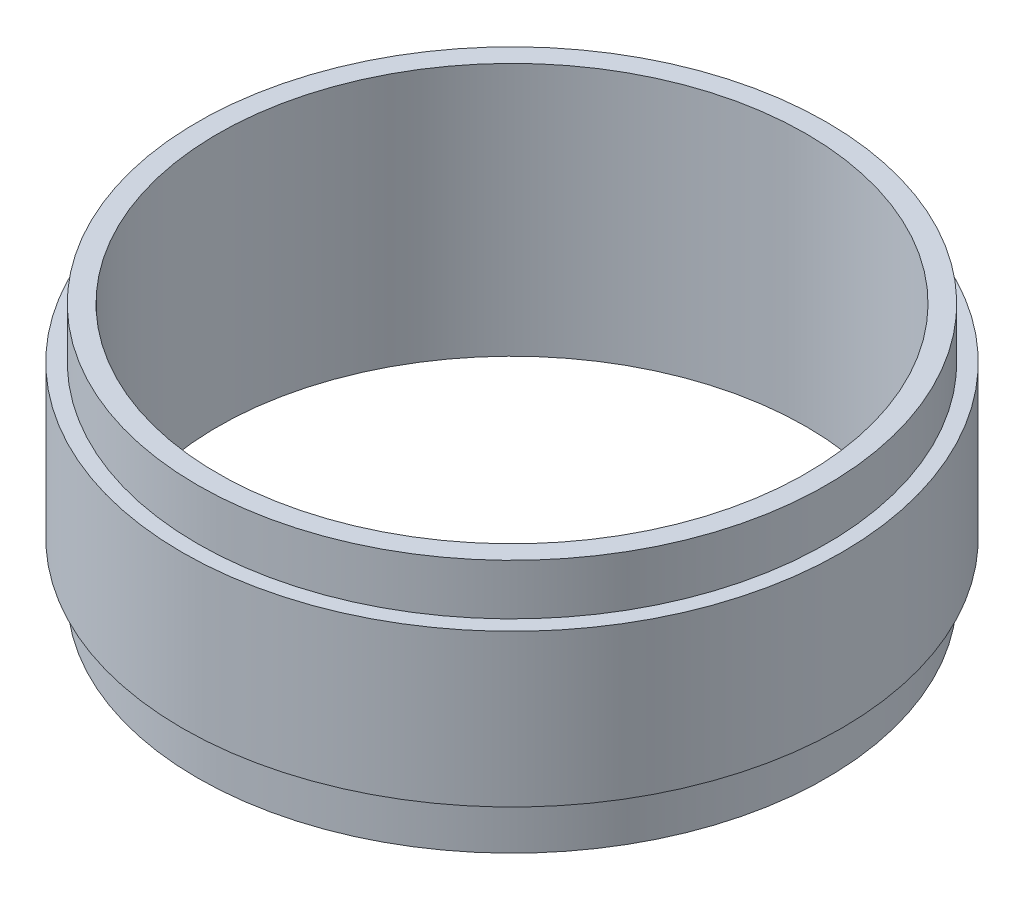
ISO-10303-21;
HEADER;
FILE_DESCRIPTION(('STEP AP214'),'2;1');
FILE_NAME('part.step','',(''),(''),'','','');
FILE_SCHEMA(('AUTOMOTIVE_DESIGN { 1 0 10303 214 1 1 1 1 }'));
ENDSEC;
DATA;
#1=APPLICATION_CONTEXT('core data for automotive mechanical design processes');
#2=APPLICATION_PROTOCOL_DEFINITION('international standard','automotive_design',2000,#1);
#3=PRODUCT_CONTEXT('',#1,'mechanical');
#4=PRODUCT('Part','Part','',(#3));
#5=PRODUCT_RELATED_PRODUCT_CATEGORY('part','',(#4));
#6=PRODUCT_DEFINITION_FORMATION('','',#4);
#7=PRODUCT_DEFINITION_CONTEXT('part definition',#1,'design');
#8=PRODUCT_DEFINITION('design','',#6,#7);
#9=PRODUCT_DEFINITION_SHAPE('','',#8);
#10=(LENGTH_UNIT() NAMED_UNIT(*) SI_UNIT(.MILLI.,.METRE.));
#11=(NAMED_UNIT(*) PLANE_ANGLE_UNIT() SI_UNIT($,.RADIAN.));
#12=(NAMED_UNIT(*) SI_UNIT($,.STERADIAN.) SOLID_ANGLE_UNIT());
#13=UNCERTAINTY_MEASURE_WITH_UNIT(LENGTH_MEASURE(1.E-05),#10,'distance_accuracy_value','');
#14=(GEOMETRIC_REPRESENTATION_CONTEXT(3) GLOBAL_UNCERTAINTY_ASSIGNED_CONTEXT((#13)) GLOBAL_UNIT_ASSIGNED_CONTEXT((#10,
#11,#12)) REPRESENTATION_CONTEXT('',''));
#15=CARTESIAN_POINT('',(0.,0.,0.));
#16=DIRECTION('',(0.,0.,1.));
#17=DIRECTION('',(1.,0.,0.));
#18=AXIS2_PLACEMENT_3D('',#15,#16,#17);
#19=CARTESIAN_POINT('',(0.,0.,0.));
#20=DIRECTION('',(0.,-1.,0.));
#21=DIRECTION('',(0.,0.,-1.));
#22=AXIS2_PLACEMENT_3D('',#19,#20,#21);
#23=CYLINDRICAL_SURFACE('',#22,62.);
#24=CARTESIAN_POINT('',(0.,50.,0.));
#25=DIRECTION('',(0.,-1.,0.));
#26=DIRECTION('',(0.,0.,-1.));
#27=AXIS2_PLACEMENT_3D('',#24,#25,#26);
#28=CIRCLE('',#27,62.);
#29=CARTESIAN_POINT('',(0.,50.,-62.));
#30=VERTEX_POINT('',#29);
#31=EDGE_CURVE('E69',#30,#30,#28,.T.);
#32=ORIENTED_EDGE('',*,*,#31,.T.);
#33=EDGE_LOOP('',(#32));
#34=FACE_BOUND('',#33,.T.);
#35=CARTESIAN_POINT('',(0.,40.,0.));
#36=DIRECTION('',(0.,-1.,0.));
#37=DIRECTION('',(0.,0.,-1.));
#38=AXIS2_PLACEMENT_3D('',#35,#36,#37);
#39=CIRCLE('',#38,62.);
#40=CARTESIAN_POINT('',(0.,40.,-62.));
#41=VERTEX_POINT('',#40);
#42=EDGE_CURVE('E10',#41,#41,#39,.T.);
#43=ORIENTED_EDGE('',*,*,#42,.F.);
#44=EDGE_LOOP('',(#43));
#45=FACE_BOUND('',#44,.T.);
#46=ADVANCED_FACE('F41',(#34,#45),#23,.T.);
#47=CARTESIAN_POINT('',(0.,40.,0.));
#48=DIRECTION('',(0.,1.,0.));
#49=DIRECTION('',(0.,0.,1.));
#50=AXIS2_PLACEMENT_3D('',#47,#48,#49);
#51=PLANE('',#50);
#52=ORIENTED_EDGE('',*,*,#42,.T.);
#53=EDGE_LOOP('',(#52));
#54=FACE_BOUND('',#53,.T.);
#55=CARTESIAN_POINT('',(0.,40.,0.));
#56=DIRECTION('',(0.,-1.,0.));
#57=DIRECTION('',(0.,0.,-1.));
#58=AXIS2_PLACEMENT_3D('',#55,#56,#57);
#59=CIRCLE('',#58,65.);
#60=CARTESIAN_POINT('',(0.,40.,-65.));
#61=VERTEX_POINT('',#60);
#62=EDGE_CURVE('E47',#61,#61,#59,.T.);
#63=ORIENTED_EDGE('',*,*,#62,.F.);
#64=EDGE_LOOP('',(#63));
#65=FACE_BOUND('',#64,.T.);
#66=ADVANCED_FACE('F99',(#54,#65),#51,.T.);
#67=CARTESIAN_POINT('',(0.,0.,0.));
#68=DIRECTION('',(0.,-1.,0.));
#69=DIRECTION('',(0.,0.,-1.));
#70=AXIS2_PLACEMENT_3D('',#67,#68,#69);
#71=CYLINDRICAL_SURFACE('',#70,65.);
#72=ORIENTED_EDGE('',*,*,#62,.T.);
#73=EDGE_LOOP('',(#72));
#74=FACE_BOUND('',#73,.T.);
#75=CARTESIAN_POINT('',(0.,9.99999999999997,0.));
#76=DIRECTION('',(0.,-1.,0.));
#77=DIRECTION('',(0.,0.,-1.));
#78=AXIS2_PLACEMENT_3D('',#75,#76,#77);
#79=CIRCLE('',#78,65.);
#80=CARTESIAN_POINT('',(0.,9.99999999999997,-65.));
#81=VERTEX_POINT('',#80);
#82=EDGE_CURVE('E51',#81,#81,#79,.T.);
#83=ORIENTED_EDGE('',*,*,#82,.F.);
#84=EDGE_LOOP('',(#83));
#85=FACE_BOUND('',#84,.T.);
#86=ADVANCED_FACE('F103',(#74,#85),#71,.T.);
#87=CARTESIAN_POINT('',(0.,9.99999999999997,0.));
#88=DIRECTION('',(0.,1.,0.));
#89=DIRECTION('',(0.,0.,1.));
#90=AXIS2_PLACEMENT_3D('',#87,#88,#89);
#91=PLANE('',#90);
#92=CARTESIAN_POINT('',(0.,9.99999999999997,0.));
#93=DIRECTION('',(0.,-1.,0.));
#94=DIRECTION('',(0.,0.,-1.));
#95=AXIS2_PLACEMENT_3D('',#92,#93,#94);
#96=CIRCLE('',#95,62.);
#97=CARTESIAN_POINT('',(0.,9.99999999999997,-62.));
#98=VERTEX_POINT('',#97);
#99=EDGE_CURVE('E55',#98,#98,#96,.T.);
#100=ORIENTED_EDGE('',*,*,#99,.F.);
#101=EDGE_LOOP('',(#100));
#102=FACE_BOUND('',#101,.T.);
#103=ORIENTED_EDGE('',*,*,#82,.T.);
#104=EDGE_LOOP('',(#103));
#105=FACE_BOUND('',#104,.T.);
#106=ADVANCED_FACE('F95',(#102,#105),#91,.F.);
#107=CARTESIAN_POINT('',(0.,0.,0.));
#108=DIRECTION('',(0.,-1.,0.));
#109=DIRECTION('',(0.,0.,-1.));
#110=AXIS2_PLACEMENT_3D('',#107,#108,#109);
#111=CYLINDRICAL_SURFACE('',#110,62.);
#112=CARTESIAN_POINT('',(0.,0.,0.));
#113=DIRECTION('',(0.,-1.,0.));
#114=DIRECTION('',(0.,0.,-1.));
#115=AXIS2_PLACEMENT_3D('',#112,#113,#114);
#116=CIRCLE('',#115,62.);
#117=CARTESIAN_POINT('',(0.,0.,-62.));
#118=VERTEX_POINT('',#117);
#119=EDGE_CURVE('E60',#118,#118,#116,.T.);
#120=ORIENTED_EDGE('',*,*,#119,.F.);
#121=EDGE_LOOP('',(#120));
#122=FACE_BOUND('',#121,.T.);
#123=ORIENTED_EDGE('',*,*,#99,.T.);
#124=EDGE_LOOP('',(#123));
#125=FACE_BOUND('',#124,.T.);
#126=ADVANCED_FACE('F89',(#122,#125),#111,.T.);
#127=CARTESIAN_POINT('',(0.,0.,0.));
#128=DIRECTION('',(0.,-1.,0.));
#129=DIRECTION('',(0.,0.,-1.));
#130=AXIS2_PLACEMENT_3D('',#127,#128,#129);
#131=PLANE('',#130);
#132=ORIENTED_EDGE('',*,*,#119,.T.);
#133=EDGE_LOOP('',(#132));
#134=FACE_BOUND('',#133,.T.);
#135=CARTESIAN_POINT('',(0.,0.,0.));
#136=DIRECTION('',(0.,-1.,0.));
#137=DIRECTION('',(0.,0.,-1.));
#138=AXIS2_PLACEMENT_3D('',#135,#136,#137);
#139=CIRCLE('',#138,58.);
#140=CARTESIAN_POINT('',(0.,0.,-58.));
#141=VERTEX_POINT('',#140);
#142=EDGE_CURVE('E63',#141,#141,#139,.T.);
#143=ORIENTED_EDGE('',*,*,#142,.F.);
#144=EDGE_LOOP('',(#143));
#145=FACE_BOUND('',#144,.T.);
#146=ADVANCED_FACE('F84',(#134,#145),#131,.T.);
#147=CARTESIAN_POINT('',(0.,0.,0.));
#148=DIRECTION('',(0.,-1.,0.));
#149=DIRECTION('',(0.,0.,-1.));
#150=AXIS2_PLACEMENT_3D('',#147,#148,#149);
#151=CYLINDRICAL_SURFACE('',#150,58.);
#152=CARTESIAN_POINT('',(0.,50.,0.));
#153=DIRECTION('',(0.,-1.,0.));
#154=DIRECTION('',(0.,0.,-1.));
#155=AXIS2_PLACEMENT_3D('',#152,#153,#154);
#156=CIRCLE('',#155,58.);
#157=CARTESIAN_POINT('',(0.,50.,-58.));
#158=VERTEX_POINT('',#157);
#159=EDGE_CURVE('E66',#158,#158,#156,.T.);
#160=ORIENTED_EDGE('',*,*,#159,.F.);
#161=EDGE_LOOP('',(#160));
#162=FACE_BOUND('',#161,.T.);
#163=ORIENTED_EDGE('',*,*,#142,.T.);
#164=EDGE_LOOP('',(#163));
#165=FACE_BOUND('',#164,.T.);
#166=ADVANCED_FACE('F78',(#162,#165),#151,.F.);
#167=CARTESIAN_POINT('',(0.,50.,0.));
#168=DIRECTION('',(0.,-1.,0.));
#169=DIRECTION('',(0.,0.,-1.));
#170=AXIS2_PLACEMENT_3D('',#167,#168,#169);
#171=PLANE('',#170);
#172=ORIENTED_EDGE('',*,*,#31,.F.);
#173=EDGE_LOOP('',(#172));
#174=FACE_BOUND('',#173,.T.);
#175=ORIENTED_EDGE('',*,*,#159,.T.);
#176=EDGE_LOOP('',(#175));
#177=FACE_BOUND('',#176,.T.);
#178=ADVANCED_FACE('F75',(#174,#177),#171,.F.);
#179=CLOSED_SHELL('',(#46,#66,#86,#106,#126,#146,#166,#178));
#180=MANIFOLD_SOLID_BREP('B2',#179);
#181=ADVANCED_BREP_SHAPE_REPRESENTATION('',(#18,#180),#14);
#182=SHAPE_DEFINITION_REPRESENTATION(#9,#181);
ENDSEC;
END-ISO-10303-21;
